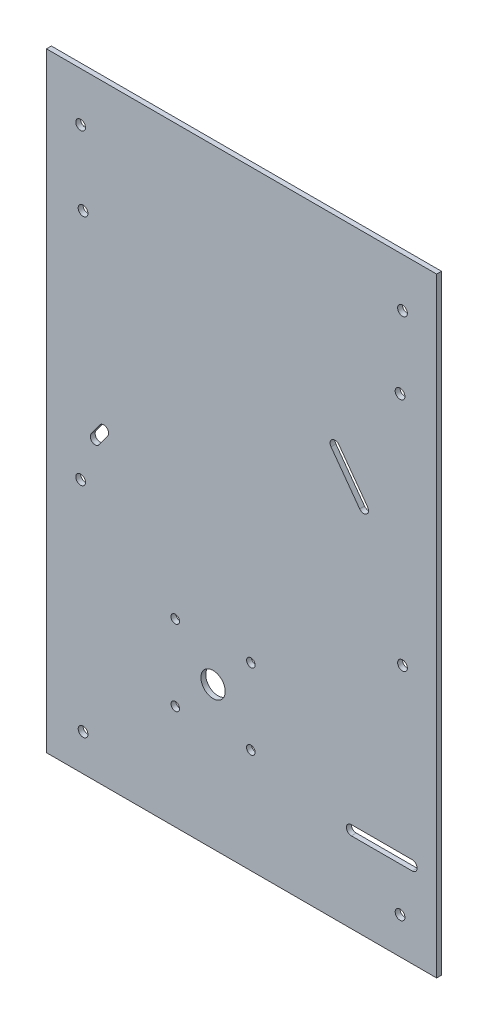
ISO-10303-21;
HEADER;
FILE_DESCRIPTION(('STEP AP214'),'2;1');
FILE_NAME('part.step','',(''),(''),'','','');
FILE_SCHEMA(('AUTOMOTIVE_DESIGN { 1 0 10303 214 1 1 1 1 }'));
ENDSEC;
DATA;
#1=APPLICATION_CONTEXT('core data for automotive mechanical design processes');
#2=APPLICATION_PROTOCOL_DEFINITION('international standard','automotive_design',2000,#1);
#3=PRODUCT_CONTEXT('',#1,'mechanical');
#4=PRODUCT('Part','Part','',(#3));
#5=PRODUCT_RELATED_PRODUCT_CATEGORY('part','',(#4));
#6=PRODUCT_DEFINITION_FORMATION('','',#4);
#7=PRODUCT_DEFINITION_CONTEXT('part definition',#1,'design');
#8=PRODUCT_DEFINITION('design','',#6,#7);
#9=PRODUCT_DEFINITION_SHAPE('','',#8);
#10=(LENGTH_UNIT() NAMED_UNIT(*) SI_UNIT(.MILLI.,.METRE.));
#11=(NAMED_UNIT(*) PLANE_ANGLE_UNIT() SI_UNIT($,.RADIAN.));
#12=(NAMED_UNIT(*) SI_UNIT($,.STERADIAN.) SOLID_ANGLE_UNIT());
#13=UNCERTAINTY_MEASURE_WITH_UNIT(LENGTH_MEASURE(1.E-05),#10,'distance_accuracy_value','');
#14=(GEOMETRIC_REPRESENTATION_CONTEXT(3) GLOBAL_UNCERTAINTY_ASSIGNED_CONTEXT((#13)) GLOBAL_UNIT_ASSIGNED_CONTEXT((#10,
#11,#12)) REPRESENTATION_CONTEXT('',''));
#15=CARTESIAN_POINT('',(0.,0.,0.));
#16=DIRECTION('',(0.,0.,1.));
#17=DIRECTION('',(1.,0.,0.));
#18=AXIS2_PLACEMENT_3D('',#15,#16,#17);
#19=CARTESIAN_POINT('',(80.,125.,-2.));
#20=DIRECTION('',(1.,0.,0.));
#21=DIRECTION('',(0.,1.,0.));
#22=AXIS2_PLACEMENT_3D('',#19,#20,#21);
#23=PLANE('',#22);
#24=DIRECTION('',(0.,1.,0.));
#25=VECTOR('',#24,1.);
#26=CARTESIAN_POINT('',(80.,125.,0.));
#27=LINE('',#26,#25);
#28=CARTESIAN_POINT('',(80.,-125.,0.));
#29=VERTEX_POINT('',#28);
#30=CARTESIAN_POINT('',(80.,125.,0.));
#31=VERTEX_POINT('',#30);
#32=EDGE_CURVE('E263',#29,#31,#27,.T.);
#33=ORIENTED_EDGE('',*,*,#32,.F.);
#34=DIRECTION('',(0.,0.,1.));
#35=VECTOR('',#34,1.);
#36=CARTESIAN_POINT('',(80.,-125.,-2.));
#37=LINE('',#36,#35);
#38=CARTESIAN_POINT('',(80.,-125.,-2.));
#39=VERTEX_POINT('',#38);
#40=EDGE_CURVE('E11',#39,#29,#37,.T.);
#41=ORIENTED_EDGE('',*,*,#40,.F.);
#42=DIRECTION('',(0.,1.,0.));
#43=VECTOR('',#42,1.);
#44=CARTESIAN_POINT('',(80.,125.,-2.));
#45=LINE('',#44,#43);
#46=CARTESIAN_POINT('',(80.,125.,-2.));
#47=VERTEX_POINT('',#46);
#48=EDGE_CURVE('E270',#39,#47,#45,.T.);
#49=ORIENTED_EDGE('',*,*,#48,.T.);
#50=DIRECTION('',(0.,0.,1.));
#51=VECTOR('',#50,1.);
#52=CARTESIAN_POINT('',(80.,125.,-2.));
#53=LINE('',#52,#51);
#54=EDGE_CURVE('E41',#47,#31,#53,.T.);
#55=ORIENTED_EDGE('',*,*,#54,.T.);
#56=EDGE_LOOP('',(#33,#41,#49,#55));
#57=FACE_BOUND('',#56,.T.);
#58=ADVANCED_FACE('F38',(#57),#23,.T.);
#59=CARTESIAN_POINT('',(-80.,-125.,-2.));
#60=DIRECTION('',(0.,-1.,0.));
#61=DIRECTION('',(0.,0.,-1.));
#62=AXIS2_PLACEMENT_3D('',#59,#60,#61);
#63=PLANE('',#62);
#64=DIRECTION('',(1.,0.,0.));
#65=VECTOR('',#64,1.);
#66=CARTESIAN_POINT('',(-80.,-125.,0.));
#67=LINE('',#66,#65);
#68=CARTESIAN_POINT('',(-80.,-125.,0.));
#69=VERTEX_POINT('',#68);
#70=EDGE_CURVE('E274',#69,#29,#67,.T.);
#71=ORIENTED_EDGE('',*,*,#70,.F.);
#72=DIRECTION('',(0.,0.,1.));
#73=VECTOR('',#72,1.);
#74=CARTESIAN_POINT('',(-80.,-125.,-2.));
#75=LINE('',#74,#73);
#76=CARTESIAN_POINT('',(-80.,-125.,-2.));
#77=VERTEX_POINT('',#76);
#78=EDGE_CURVE('E46',#77,#69,#75,.T.);
#79=ORIENTED_EDGE('',*,*,#78,.F.);
#80=DIRECTION('',(1.,0.,0.));
#81=VECTOR('',#80,1.);
#82=CARTESIAN_POINT('',(-80.,-125.,-2.));
#83=LINE('',#82,#81);
#84=EDGE_CURVE('E280',#77,#39,#83,.T.);
#85=ORIENTED_EDGE('',*,*,#84,.T.);
#86=ORIENTED_EDGE('',*,*,#40,.T.);
#87=EDGE_LOOP('',(#71,#79,#85,#86));
#88=FACE_BOUND('',#87,.T.);
#89=ADVANCED_FACE('F306',(#88),#63,.T.);
#90=CARTESIAN_POINT('',(-80.,125.,-2.));
#91=DIRECTION('',(-1.,0.,0.));
#92=DIRECTION('',(0.,-1.,0.));
#93=AXIS2_PLACEMENT_3D('',#90,#91,#92);
#94=PLANE('',#93);
#95=DIRECTION('',(0.,-1.,0.));
#96=VECTOR('',#95,1.);
#97=CARTESIAN_POINT('',(-80.,125.,0.));
#98=LINE('',#97,#96);
#99=CARTESIAN_POINT('',(-80.,125.,0.));
#100=VERTEX_POINT('',#99);
#101=EDGE_CURVE('E288',#100,#69,#98,.T.);
#102=ORIENTED_EDGE('',*,*,#101,.F.);
#103=DIRECTION('',(0.,0.,1.));
#104=VECTOR('',#103,1.);
#105=CARTESIAN_POINT('',(-80.,125.,-2.));
#106=LINE('',#105,#104);
#107=CARTESIAN_POINT('',(-80.,125.,-2.));
#108=VERTEX_POINT('',#107);
#109=EDGE_CURVE('E293',#108,#100,#106,.T.);
#110=ORIENTED_EDGE('',*,*,#109,.F.);
#111=DIRECTION('',(0.,-1.,0.));
#112=VECTOR('',#111,1.);
#113=CARTESIAN_POINT('',(-80.,125.,-2.));
#114=LINE('',#113,#112);
#115=EDGE_CURVE('E277',#108,#77,#114,.T.);
#116=ORIENTED_EDGE('',*,*,#115,.T.);
#117=ORIENTED_EDGE('',*,*,#78,.T.);
#118=EDGE_LOOP('',(#102,#110,#116,#117));
#119=FACE_BOUND('',#118,.T.);
#120=ADVANCED_FACE('F311',(#119),#94,.T.);
#121=CARTESIAN_POINT('',(-80.,125.,-2.));
#122=DIRECTION('',(0.,1.,0.));
#123=DIRECTION('',(0.,0.,1.));
#124=AXIS2_PLACEMENT_3D('',#121,#122,#123);
#125=PLANE('',#124);
#126=DIRECTION('',(-1.,0.,0.));
#127=VECTOR('',#126,1.);
#128=CARTESIAN_POINT('',(-80.,125.,0.));
#129=LINE('',#128,#127);
#130=EDGE_CURVE('E285',#31,#100,#129,.T.);
#131=ORIENTED_EDGE('',*,*,#130,.F.);
#132=ORIENTED_EDGE('',*,*,#54,.F.);
#133=DIRECTION('',(-1.,0.,0.));
#134=VECTOR('',#133,1.);
#135=CARTESIAN_POINT('',(-80.,125.,-2.));
#136=LINE('',#135,#134);
#137=EDGE_CURVE('E273',#47,#108,#136,.T.);
#138=ORIENTED_EDGE('',*,*,#137,.T.);
#139=ORIENTED_EDGE('',*,*,#109,.T.);
#140=EDGE_LOOP('',(#131,#132,#138,#139));
#141=FACE_BOUND('',#140,.T.);
#142=ADVANCED_FACE('F301',(#141),#125,.T.);
#143=CARTESIAN_POINT('',(0.,0.,-2.));
#144=DIRECTION('',(0.,0.,1.));
#145=DIRECTION('',(1.,0.,0.));
#146=AXIS2_PLACEMENT_3D('',#143,#144,#145);
#147=PLANE('',#146);
#148=CARTESIAN_POINT('',(-27.19,-51.1,-2.));
#149=DIRECTION('',(0.,0.,1.));
#150=DIRECTION('',(1.,0.,0.));
#151=AXIS2_PLACEMENT_3D('',#148,#149,#150);
#152=CIRCLE('',#151,1.75);
#153=CARTESIAN_POINT('',(-25.44,-51.1,-2.));
#154=VERTEX_POINT('',#153);
#155=EDGE_CURVE('E608',#154,#154,#152,.T.);
#156=ORIENTED_EDGE('',*,*,#155,.T.);
#157=EDGE_LOOP('',(#156));
#158=FACE_BOUND('',#157,.T.);
#159=CARTESIAN_POINT('',(3.80999999999997,-51.1,-2.));
#160=DIRECTION('',(0.,0.,1.));
#161=DIRECTION('',(1.,0.,0.));
#162=AXIS2_PLACEMENT_3D('',#159,#160,#161);
#163=CIRCLE('',#162,1.75);
#164=CARTESIAN_POINT('',(5.55999999999997,-51.1,-2.));
#165=VERTEX_POINT('',#164);
#166=EDGE_CURVE('E610',#165,#165,#163,.T.);
#167=ORIENTED_EDGE('',*,*,#166,.T.);
#168=EDGE_LOOP('',(#167));
#169=FACE_BOUND('',#168,.T.);
#170=CARTESIAN_POINT('',(3.80999999999997,-82.1,-2.));
#171=DIRECTION('',(0.,0.,1.));
#172=DIRECTION('',(1.,0.,0.));
#173=AXIS2_PLACEMENT_3D('',#170,#171,#172);
#174=CIRCLE('',#173,1.75);
#175=CARTESIAN_POINT('',(5.55999999999997,-82.1,-2.));
#176=VERTEX_POINT('',#175);
#177=EDGE_CURVE('E616',#176,#176,#174,.T.);
#178=ORIENTED_EDGE('',*,*,#177,.T.);
#179=EDGE_LOOP('',(#178));
#180=FACE_BOUND('',#179,.T.);
#181=CARTESIAN_POINT('',(-27.19,-82.1,-2.));
#182=DIRECTION('',(0.,0.,1.));
#183=DIRECTION('',(1.,0.,0.));
#184=AXIS2_PLACEMENT_3D('',#181,#182,#183);
#185=CIRCLE('',#184,1.75);
#186=CARTESIAN_POINT('',(-25.44,-82.1,-2.));
#187=VERTEX_POINT('',#186);
#188=EDGE_CURVE('E720',#187,#187,#185,.T.);
#189=ORIENTED_EDGE('',*,*,#188,.T.);
#190=EDGE_LOOP('',(#189));
#191=FACE_BOUND('',#190,.T.);
#192=CARTESIAN_POINT('',(66.,-21.,-2.));
#193=DIRECTION('',(0.,0.,1.));
#194=DIRECTION('',(1.,0.,0.));
#195=AXIS2_PLACEMENT_3D('',#192,#193,#194);
#196=CIRCLE('',#195,2.);
#197=CARTESIAN_POINT('',(68.,-21.,-2.));
#198=VERTEX_POINT('',#197);
#199=EDGE_CURVE('E201',#198,#198,#196,.T.);
#200=ORIENTED_EDGE('',*,*,#199,.T.);
#201=EDGE_LOOP('',(#200));
#202=FACE_BOUND('',#201,.T.);
#203=CARTESIAN_POINT('',(-66.,105.,-2.));
#204=DIRECTION('',(0.,0.,1.));
#205=DIRECTION('',(1.,0.,0.));
#206=AXIS2_PLACEMENT_3D('',#203,#204,#205);
#207=CIRCLE('',#206,2.);
#208=CARTESIAN_POINT('',(-64.,105.,-2.));
#209=VERTEX_POINT('',#208);
#210=EDGE_CURVE('E650',#209,#209,#207,.T.);
#211=ORIENTED_EDGE('',*,*,#210,.T.);
#212=EDGE_LOOP('',(#211));
#213=FACE_BOUND('',#212,.T.);
#214=CARTESIAN_POINT('',(66.,105.,-2.));
#215=DIRECTION('',(0.,0.,1.));
#216=DIRECTION('',(1.,0.,0.));
#217=AXIS2_PLACEMENT_3D('',#214,#215,#216);
#218=CIRCLE('',#217,2.);
#219=CARTESIAN_POINT('',(68.,105.,-2.));
#220=VERTEX_POINT('',#219);
#221=EDGE_CURVE('E635',#220,#220,#218,.T.);
#222=ORIENTED_EDGE('',*,*,#221,.T.);
#223=EDGE_LOOP('',(#222));
#224=FACE_BOUND('',#223,.T.);
#225=CARTESIAN_POINT('',(65.,75.,-2.));
#226=DIRECTION('',(0.,0.,1.));
#227=DIRECTION('',(1.,0.,0.));
#228=AXIS2_PLACEMENT_3D('',#225,#226,#227);
#229=CIRCLE('',#228,2.);
#230=CARTESIAN_POINT('',(67.,75.,-2.));
#231=VERTEX_POINT('',#230);
#232=EDGE_CURVE('E641',#231,#231,#229,.T.);
#233=ORIENTED_EDGE('',*,*,#232,.T.);
#234=EDGE_LOOP('',(#233));
#235=FACE_BOUND('',#234,.T.);
#236=CARTESIAN_POINT('',(-11.69,-66.6,-2.));
#237=DIRECTION('',(0.,0.,1.));
#238=DIRECTION('',(1.,0.,0.));
#239=AXIS2_PLACEMENT_3D('',#236,#237,#238);
#240=CIRCLE('',#239,5.);
#241=CARTESIAN_POINT('',(-6.69000000000003,-66.6,-2.));
#242=VERTEX_POINT('',#241);
#243=EDGE_CURVE('E202',#242,#242,#240,.T.);
#244=ORIENTED_EDGE('',*,*,#243,.T.);
#245=EDGE_LOOP('',(#244));
#246=FACE_BOUND('',#245,.T.);
#247=DIRECTION('',(0.586666666666667,0.809828514083211,0.));
#248=VECTOR('',#247,1.);
#249=CARTESIAN_POINT('',(-54.9003429718336,0.0156377511659183,-2.));
#250=LINE('',#249,#248);
#251=CARTESIAN_POINT('',(-58.4203429718336,-4.84333333333335,-2.));
#252=VERTEX_POINT('',#251);
#253=CARTESIAN_POINT('',(-54.9003429718336,0.0156377511659183,-2.));
#254=VERTEX_POINT('',#253);
#255=EDGE_CURVE('E218',#252,#254,#250,.T.);
#256=ORIENTED_EDGE('',*,*,#255,.T.);
#257=CARTESIAN_POINT('',(-56.52,1.18897108449926,-2.));
#258=DIRECTION('',(0.,0.,1.));
#259=DIRECTION('',(1.,0.,0.));
#260=AXIS2_PLACEMENT_3D('',#257,#258,#259);
#261=CIRCLE('',#260,2.00000000000001);
#262=CARTESIAN_POINT('',(-58.1396570281664,2.36230441783259,-2.));
#263=VERTEX_POINT('',#262);
#264=EDGE_CURVE('E210',#254,#263,#261,.T.);
#265=ORIENTED_EDGE('',*,*,#264,.T.);
#266=DIRECTION('',(-0.586666666666669,-0.80982851408321,0.));
#267=VECTOR('',#266,1.);
#268=CARTESIAN_POINT('',(-58.1396570281664,2.36230441783259,-2.));
#269=LINE('',#268,#267);
#270=CARTESIAN_POINT('',(-61.6596570281664,-2.49666666666666,-2.));
#271=VERTEX_POINT('',#270);
#272=EDGE_CURVE('E213',#263,#271,#269,.T.);
#273=ORIENTED_EDGE('',*,*,#272,.T.);
#274=CARTESIAN_POINT('',(-60.04,-3.67000000000001,-2.));
#275=DIRECTION('',(0.,0.,1.));
#276=DIRECTION('',(1.,0.,0.));
#277=AXIS2_PLACEMENT_3D('',#274,#275,#276);
#278=CIRCLE('',#277,2.00000000000001);
#279=EDGE_CURVE('E54',#271,#252,#278,.T.);
#280=ORIENTED_EDGE('',*,*,#279,.T.);
#281=EDGE_LOOP('',(#256,#265,#273,#280));
#282=FACE_BOUND('',#281,.T.);
#283=DIRECTION('',(-0.587499999999999,0.809224165481977,0.));
#284=VECTOR('',#283,1.);
#285=CARTESIAN_POINT('',(39.9284483309639,44.355,-2.));
#286=LINE('',#285,#284);
#287=CARTESIAN_POINT('',(51.6784483309639,28.1705166903604,-2.));
#288=VERTEX_POINT('',#287);
#289=CARTESIAN_POINT('',(39.9284483309639,44.355,-2.));
#290=VERTEX_POINT('',#289);
#291=EDGE_CURVE('E163',#288,#290,#286,.T.);
#292=ORIENTED_EDGE('',*,*,#291,.T.);
#293=CARTESIAN_POINT('',(38.31,43.18,-2.));
#294=DIRECTION('',(0.,0.,1.));
#295=DIRECTION('',(1.,0.,0.));
#296=AXIS2_PLACEMENT_3D('',#293,#294,#295);
#297=CIRCLE('',#296,1.99999999999999);
#298=CARTESIAN_POINT('',(36.6915516690361,42.005,-2.));
#299=VERTEX_POINT('',#298);
#300=EDGE_CURVE('E155',#290,#299,#297,.T.);
#301=ORIENTED_EDGE('',*,*,#300,.T.);
#302=DIRECTION('',(0.587499999999999,-0.809224165481977,0.));
#303=VECTOR('',#302,1.);
#304=CARTESIAN_POINT('',(36.6915516690361,42.005,-2.));
#305=LINE('',#304,#303);
#306=CARTESIAN_POINT('',(48.441551669036,25.8205166903605,-2.));
#307=VERTEX_POINT('',#306);
#308=EDGE_CURVE('E166',#299,#307,#305,.T.);
#309=ORIENTED_EDGE('',*,*,#308,.T.);
#310=CARTESIAN_POINT('',(50.06,26.9955166903604,-2.));
#311=DIRECTION('',(0.,0.,1.));
#312=DIRECTION('',(1.,0.,0.));
#313=AXIS2_PLACEMENT_3D('',#310,#311,#312);
#314=CIRCLE('',#313,1.99999999999999);
#315=EDGE_CURVE('E62',#307,#288,#314,.T.);
#316=ORIENTED_EDGE('',*,*,#315,.T.);
#317=EDGE_LOOP('',(#292,#301,#309,#316));
#318=FACE_BOUND('',#317,.T.);
#319=CARTESIAN_POINT('',(-66.,-21.,-2.));
#320=DIRECTION('',(0.,0.,1.));
#321=DIRECTION('',(1.,0.,0.));
#322=AXIS2_PLACEMENT_3D('',#319,#320,#321);
#323=CIRCLE('',#322,2.);
#324=CARTESIAN_POINT('',(-64.,-21.,-2.));
#325=VERTEX_POINT('',#324);
#326=EDGE_CURVE('E186',#325,#325,#323,.T.);
#327=ORIENTED_EDGE('',*,*,#326,.T.);
#328=EDGE_LOOP('',(#327));
#329=FACE_BOUND('',#328,.T.);
#330=CARTESIAN_POINT('',(-65.,75.,-2.));
#331=DIRECTION('',(0.,0.,1.));
#332=DIRECTION('',(1.,0.,0.));
#333=AXIS2_PLACEMENT_3D('',#330,#331,#332);
#334=CIRCLE('',#333,2.);
#335=CARTESIAN_POINT('',(-63.,75.,-2.));
#336=VERTEX_POINT('',#335);
#337=EDGE_CURVE('E620',#336,#336,#334,.T.);
#338=ORIENTED_EDGE('',*,*,#337,.T.);
#339=EDGE_LOOP('',(#338));
#340=FACE_BOUND('',#339,.T.);
#341=CARTESIAN_POINT('',(-65.,-110.,-2.));
#342=DIRECTION('',(0.,0.,1.));
#343=DIRECTION('',(1.,0.,0.));
#344=AXIS2_PLACEMENT_3D('',#341,#342,#343);
#345=CIRCLE('',#344,2.);
#346=CARTESIAN_POINT('',(-63.,-110.,-2.));
#347=VERTEX_POINT('',#346);
#348=EDGE_CURVE('E627',#347,#347,#345,.T.);
#349=ORIENTED_EDGE('',*,*,#348,.T.);
#350=EDGE_LOOP('',(#349));
#351=FACE_BOUND('',#350,.T.);
#352=CARTESIAN_POINT('',(65.,-110.,-2.));
#353=DIRECTION('',(0.,0.,1.));
#354=DIRECTION('',(1.,0.,0.));
#355=AXIS2_PLACEMENT_3D('',#352,#353,#354);
#356=CIRCLE('',#355,2.);
#357=CARTESIAN_POINT('',(67.,-110.,-2.));
#358=VERTEX_POINT('',#357);
#359=EDGE_CURVE('E613',#358,#358,#356,.T.);
#360=ORIENTED_EDGE('',*,*,#359,.T.);
#361=EDGE_LOOP('',(#360));
#362=FACE_BOUND('',#361,.T.);
#363=DIRECTION('',(1.,0.,0.));
#364=VECTOR('',#363,1.);
#365=CARTESIAN_POINT('',(70.,-92.,-2.));
#366=LINE('',#365,#364);
#367=CARTESIAN_POINT('',(45.,-92.,-2.));
#368=VERTEX_POINT('',#367);
#369=CARTESIAN_POINT('',(70.,-92.,-2.));
#370=VERTEX_POINT('',#369);
#371=EDGE_CURVE('E248',#368,#370,#366,.T.);
#372=ORIENTED_EDGE('',*,*,#371,.T.);
#373=CARTESIAN_POINT('',(70.,-90.,-2.));
#374=DIRECTION('',(0.,0.,1.));
#375=DIRECTION('',(1.,0.,0.));
#376=AXIS2_PLACEMENT_3D('',#373,#374,#375);
#377=CIRCLE('',#376,1.99999999999999);
#378=CARTESIAN_POINT('',(70.,-88.,-2.));
#379=VERTEX_POINT('',#378);
#380=EDGE_CURVE('E238',#370,#379,#377,.T.);
#381=ORIENTED_EDGE('',*,*,#380,.T.);
#382=DIRECTION('',(-1.,0.,0.));
#383=VECTOR('',#382,1.);
#384=CARTESIAN_POINT('',(70.,-88.,-2.));
#385=LINE('',#384,#383);
#386=CARTESIAN_POINT('',(45.,-88.,-2.));
#387=VERTEX_POINT('',#386);
#388=EDGE_CURVE('E241',#379,#387,#385,.T.);
#389=ORIENTED_EDGE('',*,*,#388,.T.);
#390=CARTESIAN_POINT('',(45.,-90.,-2.));
#391=DIRECTION('',(0.,0.,1.));
#392=DIRECTION('',(1.,0.,0.));
#393=AXIS2_PLACEMENT_3D('',#390,#391,#392);
#394=CIRCLE('',#393,2.00000000000001);
#395=EDGE_CURVE('E245',#387,#368,#394,.T.);
#396=ORIENTED_EDGE('',*,*,#395,.T.);
#397=EDGE_LOOP('',(#372,#381,#389,#396));
#398=FACE_BOUND('',#397,.T.);
#399=ORIENTED_EDGE('',*,*,#48,.F.);
#400=ORIENTED_EDGE('',*,*,#84,.F.);
#401=ORIENTED_EDGE('',*,*,#115,.F.);
#402=ORIENTED_EDGE('',*,*,#137,.F.);
#403=EDGE_LOOP('',(#399,#400,#401,#402));
#404=FACE_BOUND('',#403,.T.);
#405=ADVANCED_FACE('F170',(#158,#169,#180,#191,#202,#213,#224,#235,#246,#282,#318,#329,#340,
#351,#362,#398,#404),#147,.F.);
#406=CARTESIAN_POINT('',(0.,0.,0.));
#407=DIRECTION('',(0.,0.,1.));
#408=DIRECTION('',(1.,0.,0.));
#409=AXIS2_PLACEMENT_3D('',#406,#407,#408);
#410=PLANE('',#409);
#411=CARTESIAN_POINT('',(-27.19,-51.1,0.));
#412=DIRECTION('',(0.,0.,1.));
#413=DIRECTION('',(1.,0.,0.));
#414=AXIS2_PLACEMENT_3D('',#411,#412,#413);
#415=CIRCLE('',#414,1.75);
#416=CARTESIAN_POINT('',(-25.44,-51.1,0.));
#417=VERTEX_POINT('',#416);
#418=EDGE_CURVE('E605',#417,#417,#415,.T.);
#419=ORIENTED_EDGE('',*,*,#418,.F.);
#420=EDGE_LOOP('',(#419));
#421=FACE_BOUND('',#420,.T.);
#422=CARTESIAN_POINT('',(3.80999999999997,-51.1,0.));
#423=DIRECTION('',(0.,0.,1.));
#424=DIRECTION('',(1.,0.,0.));
#425=AXIS2_PLACEMENT_3D('',#422,#423,#424);
#426=CIRCLE('',#425,1.75);
#427=CARTESIAN_POINT('',(5.55999999999997,-51.1,0.));
#428=VERTEX_POINT('',#427);
#429=EDGE_CURVE('E728',#428,#428,#426,.T.);
#430=ORIENTED_EDGE('',*,*,#429,.F.);
#431=EDGE_LOOP('',(#430));
#432=FACE_BOUND('',#431,.T.);
#433=CARTESIAN_POINT('',(3.80999999999997,-82.1,0.));
#434=DIRECTION('',(0.,0.,1.));
#435=DIRECTION('',(1.,0.,0.));
#436=AXIS2_PLACEMENT_3D('',#433,#434,#435);
#437=CIRCLE('',#436,1.75);
#438=CARTESIAN_POINT('',(5.55999999999997,-82.1,0.));
#439=VERTEX_POINT('',#438);
#440=EDGE_CURVE('E726',#439,#439,#437,.T.);
#441=ORIENTED_EDGE('',*,*,#440,.F.);
#442=EDGE_LOOP('',(#441));
#443=FACE_BOUND('',#442,.T.);
#444=CARTESIAN_POINT('',(-27.19,-82.1,0.));
#445=DIRECTION('',(0.,0.,1.));
#446=DIRECTION('',(1.,0.,0.));
#447=AXIS2_PLACEMENT_3D('',#444,#445,#446);
#448=CIRCLE('',#447,1.75);
#449=CARTESIAN_POINT('',(-25.44,-82.1,0.));
#450=VERTEX_POINT('',#449);
#451=EDGE_CURVE('E723',#450,#450,#448,.T.);
#452=ORIENTED_EDGE('',*,*,#451,.F.);
#453=EDGE_LOOP('',(#452));
#454=FACE_BOUND('',#453,.T.);
#455=CARTESIAN_POINT('',(66.,-21.,0.));
#456=DIRECTION('',(0.,0.,1.));
#457=DIRECTION('',(1.,0.,0.));
#458=AXIS2_PLACEMENT_3D('',#455,#456,#457);
#459=CIRCLE('',#458,2.);
#460=CARTESIAN_POINT('',(68.,-21.,0.));
#461=VERTEX_POINT('',#460);
#462=EDGE_CURVE('E648',#461,#461,#459,.T.);
#463=ORIENTED_EDGE('',*,*,#462,.F.);
#464=EDGE_LOOP('',(#463));
#465=FACE_BOUND('',#464,.T.);
#466=CARTESIAN_POINT('',(-66.,105.,0.));
#467=DIRECTION('',(0.,0.,1.));
#468=DIRECTION('',(1.,0.,0.));
#469=AXIS2_PLACEMENT_3D('',#466,#467,#468);
#470=CIRCLE('',#469,2.);
#471=CARTESIAN_POINT('',(-64.,105.,0.));
#472=VERTEX_POINT('',#471);
#473=EDGE_CURVE('E179',#472,#472,#470,.T.);
#474=ORIENTED_EDGE('',*,*,#473,.F.);
#475=EDGE_LOOP('',(#474));
#476=FACE_BOUND('',#475,.T.);
#477=CARTESIAN_POINT('',(66.,105.,0.));
#478=DIRECTION('',(0.,0.,1.));
#479=DIRECTION('',(1.,0.,0.));
#480=AXIS2_PLACEMENT_3D('',#477,#478,#479);
#481=CIRCLE('',#480,2.);
#482=CARTESIAN_POINT('',(68.,105.,0.));
#483=VERTEX_POINT('',#482);
#484=EDGE_CURVE('E638',#483,#483,#481,.T.);
#485=ORIENTED_EDGE('',*,*,#484,.F.);
#486=EDGE_LOOP('',(#485));
#487=FACE_BOUND('',#486,.T.);
#488=CARTESIAN_POINT('',(65.,75.,0.));
#489=DIRECTION('',(0.,0.,1.));
#490=DIRECTION('',(1.,0.,0.));
#491=AXIS2_PLACEMENT_3D('',#488,#489,#490);
#492=CIRCLE('',#491,2.);
#493=CARTESIAN_POINT('',(67.,75.,0.));
#494=VERTEX_POINT('',#493);
#495=EDGE_CURVE('E623',#494,#494,#492,.T.);
#496=ORIENTED_EDGE('',*,*,#495,.F.);
#497=EDGE_LOOP('',(#496));
#498=FACE_BOUND('',#497,.T.);
#499=CARTESIAN_POINT('',(-11.69,-66.6,0.));
#500=DIRECTION('',(0.,0.,1.));
#501=DIRECTION('',(1.,0.,0.));
#502=AXIS2_PLACEMENT_3D('',#499,#500,#501);
#503=CIRCLE('',#502,5.);
#504=CARTESIAN_POINT('',(-6.69000000000003,-66.6,0.));
#505=VERTEX_POINT('',#504);
#506=EDGE_CURVE('E206',#505,#505,#503,.T.);
#507=ORIENTED_EDGE('',*,*,#506,.F.);
#508=EDGE_LOOP('',(#507));
#509=FACE_BOUND('',#508,.T.);
#510=CARTESIAN_POINT('',(-56.52,1.18897108449926,0.));
#511=DIRECTION('',(0.,0.,1.));
#512=DIRECTION('',(1.,0.,0.));
#513=AXIS2_PLACEMENT_3D('',#510,#511,#512);
#514=CIRCLE('',#513,2.00000000000001);
#515=CARTESIAN_POINT('',(-54.9003429718336,0.0156377511659183,0.));
#516=VERTEX_POINT('',#515);
#517=CARTESIAN_POINT('',(-58.1396570281664,2.36230441783259,0.));
#518=VERTEX_POINT('',#517);
#519=EDGE_CURVE('E192',#516,#518,#514,.T.);
#520=ORIENTED_EDGE('',*,*,#519,.F.);
#521=DIRECTION('',(0.586666666666667,0.809828514083211,0.));
#522=VECTOR('',#521,1.);
#523=CARTESIAN_POINT('',(-54.9003429718336,0.0156377511659183,0.));
#524=LINE('',#523,#522);
#525=CARTESIAN_POINT('',(-58.4203429718336,-4.84333333333335,0.));
#526=VERTEX_POINT('',#525);
#527=EDGE_CURVE('E214',#526,#516,#524,.T.);
#528=ORIENTED_EDGE('',*,*,#527,.F.);
#529=CARTESIAN_POINT('',(-60.04,-3.67000000000001,0.));
#530=DIRECTION('',(0.,0.,1.));
#531=DIRECTION('',(1.,0.,0.));
#532=AXIS2_PLACEMENT_3D('',#529,#530,#531);
#533=CIRCLE('',#532,2.00000000000001);
#534=CARTESIAN_POINT('',(-61.6596570281664,-2.49666666666666,0.));
#535=VERTEX_POINT('',#534);
#536=EDGE_CURVE('E226',#535,#526,#533,.T.);
#537=ORIENTED_EDGE('',*,*,#536,.F.);
#538=DIRECTION('',(-0.586666666666669,-0.80982851408321,0.));
#539=VECTOR('',#538,1.);
#540=CARTESIAN_POINT('',(-58.1396570281664,2.36230441783259,0.));
#541=LINE('',#540,#539);
#542=EDGE_CURVE('E223',#518,#535,#541,.T.);
#543=ORIENTED_EDGE('',*,*,#542,.F.);
#544=EDGE_LOOP('',(#520,#528,#537,#543));
#545=FACE_BOUND('',#544,.T.);
#546=CARTESIAN_POINT('',(38.31,43.18,0.));
#547=DIRECTION('',(0.,0.,1.));
#548=DIRECTION('',(1.,0.,0.));
#549=AXIS2_PLACEMENT_3D('',#546,#547,#548);
#550=CIRCLE('',#549,1.99999999999999);
#551=CARTESIAN_POINT('',(39.9284483309639,44.355,0.));
#552=VERTEX_POINT('',#551);
#553=CARTESIAN_POINT('',(36.691551669036,42.005,0.));
#554=VERTEX_POINT('',#553);
#555=EDGE_CURVE('E158',#552,#554,#550,.T.);
#556=ORIENTED_EDGE('',*,*,#555,.F.);
#557=DIRECTION('',(-0.587499999999999,0.809224165481977,0.));
#558=VECTOR('',#557,1.);
#559=CARTESIAN_POINT('',(39.9284483309639,44.355,0.));
#560=LINE('',#559,#558);
#561=CARTESIAN_POINT('',(51.6784483309639,28.1705166903604,0.));
#562=VERTEX_POINT('',#561);
#563=EDGE_CURVE('E173',#562,#552,#560,.T.);
#564=ORIENTED_EDGE('',*,*,#563,.F.);
#565=CARTESIAN_POINT('',(50.06,26.9955166903604,0.));
#566=DIRECTION('',(0.,0.,1.));
#567=DIRECTION('',(1.,0.,0.));
#568=AXIS2_PLACEMENT_3D('',#565,#566,#567);
#569=CIRCLE('',#568,1.99999999999999);
#570=CARTESIAN_POINT('',(48.441551669036,25.8205166903605,0.));
#571=VERTEX_POINT('',#570);
#572=EDGE_CURVE('E176',#571,#562,#569,.T.);
#573=ORIENTED_EDGE('',*,*,#572,.F.);
#574=DIRECTION('',(0.587499999999999,-0.809224165481977,0.));
#575=VECTOR('',#574,1.);
#576=CARTESIAN_POINT('',(36.6915516690361,42.005,0.));
#577=LINE('',#576,#575);
#578=EDGE_CURVE('E185',#554,#571,#577,.T.);
#579=ORIENTED_EDGE('',*,*,#578,.F.);
#580=EDGE_LOOP('',(#556,#564,#573,#579));
#581=FACE_BOUND('',#580,.T.);
#582=CARTESIAN_POINT('',(-66.,-21.,0.));
#583=DIRECTION('',(0.,0.,1.));
#584=DIRECTION('',(1.,0.,0.));
#585=AXIS2_PLACEMENT_3D('',#582,#583,#584);
#586=CIRCLE('',#585,2.);
#587=CARTESIAN_POINT('',(-64.,-21.,0.));
#588=VERTEX_POINT('',#587);
#589=EDGE_CURVE('E198',#588,#588,#586,.T.);
#590=ORIENTED_EDGE('',*,*,#589,.F.);
#591=EDGE_LOOP('',(#590));
#592=FACE_BOUND('',#591,.T.);
#593=CARTESIAN_POINT('',(-65.,75.,0.));
#594=DIRECTION('',(0.,0.,1.));
#595=DIRECTION('',(1.,0.,0.));
#596=AXIS2_PLACEMENT_3D('',#593,#594,#595);
#597=CIRCLE('',#596,2.);
#598=CARTESIAN_POINT('',(-63.,75.,0.));
#599=VERTEX_POINT('',#598);
#600=EDGE_CURVE('E624',#599,#599,#597,.T.);
#601=ORIENTED_EDGE('',*,*,#600,.F.);
#602=EDGE_LOOP('',(#601));
#603=FACE_BOUND('',#602,.T.);
#604=CARTESIAN_POINT('',(-65.,-110.,0.));
#605=DIRECTION('',(0.,0.,1.));
#606=DIRECTION('',(1.,0.,0.));
#607=AXIS2_PLACEMENT_3D('',#604,#605,#606);
#608=CIRCLE('',#607,2.);
#609=CARTESIAN_POINT('',(-63.,-110.,0.));
#610=VERTEX_POINT('',#609);
#611=EDGE_CURVE('E630',#610,#610,#608,.T.);
#612=ORIENTED_EDGE('',*,*,#611,.F.);
#613=EDGE_LOOP('',(#612));
#614=FACE_BOUND('',#613,.T.);
#615=CARTESIAN_POINT('',(65.,-110.,0.));
#616=DIRECTION('',(0.,0.,1.));
#617=DIRECTION('',(1.,0.,0.));
#618=AXIS2_PLACEMENT_3D('',#615,#616,#617);
#619=CIRCLE('',#618,2.);
#620=CARTESIAN_POINT('',(67.,-110.,0.));
#621=VERTEX_POINT('',#620);
#622=EDGE_CURVE('E609',#621,#621,#619,.T.);
#623=ORIENTED_EDGE('',*,*,#622,.F.);
#624=EDGE_LOOP('',(#623));
#625=FACE_BOUND('',#624,.T.);
#626=CARTESIAN_POINT('',(70.,-90.,0.));
#627=DIRECTION('',(0.,0.,1.));
#628=DIRECTION('',(1.,0.,0.));
#629=AXIS2_PLACEMENT_3D('',#626,#627,#628);
#630=CIRCLE('',#629,1.99999999999999);
#631=CARTESIAN_POINT('',(70.,-92.,0.));
#632=VERTEX_POINT('',#631);
#633=CARTESIAN_POINT('',(70.,-88.,0.));
#634=VERTEX_POINT('',#633);
#635=EDGE_CURVE('E205',#632,#634,#630,.T.);
#636=ORIENTED_EDGE('',*,*,#635,.F.);
#637=DIRECTION('',(1.,0.,0.));
#638=VECTOR('',#637,1.);
#639=CARTESIAN_POINT('',(70.,-92.,0.));
#640=LINE('',#639,#638);
#641=CARTESIAN_POINT('',(45.,-92.,0.));
#642=VERTEX_POINT('',#641);
#643=EDGE_CURVE('E242',#642,#632,#640,.T.);
#644=ORIENTED_EDGE('',*,*,#643,.F.);
#645=CARTESIAN_POINT('',(45.,-90.,0.));
#646=DIRECTION('',(0.,0.,1.));
#647=DIRECTION('',(1.,0.,0.));
#648=AXIS2_PLACEMENT_3D('',#645,#646,#647);
#649=CIRCLE('',#648,2.00000000000001);
#650=CARTESIAN_POINT('',(45.,-88.,0.));
#651=VERTEX_POINT('',#650);
#652=EDGE_CURVE('E256',#651,#642,#649,.T.);
#653=ORIENTED_EDGE('',*,*,#652,.F.);
#654=DIRECTION('',(-1.,0.,0.));
#655=VECTOR('',#654,1.);
#656=CARTESIAN_POINT('',(70.,-88.,0.));
#657=LINE('',#656,#655);
#658=EDGE_CURVE('E253',#634,#651,#657,.T.);
#659=ORIENTED_EDGE('',*,*,#658,.F.);
#660=EDGE_LOOP('',(#636,#644,#653,#659));
#661=FACE_BOUND('',#660,.T.);
#662=ORIENTED_EDGE('',*,*,#32,.T.);
#663=ORIENTED_EDGE('',*,*,#130,.T.);
#664=ORIENTED_EDGE('',*,*,#101,.T.);
#665=ORIENTED_EDGE('',*,*,#70,.T.);
#666=EDGE_LOOP('',(#662,#663,#664,#665));
#667=FACE_BOUND('',#666,.T.);
#668=ADVANCED_FACE('F303',(#421,#432,#443,#454,#465,#476,#487,#498,#509,#545,#581,#592,#603,
#614,#625,#661,#667),#410,.T.);
#669=CARTESIAN_POINT('',(70.,-90.,-2.));
#670=DIRECTION('',(0.,0.,1.));
#671=DIRECTION('',(1.,0.,0.));
#672=AXIS2_PLACEMENT_3D('',#669,#670,#671);
#673=CYLINDRICAL_SURFACE('',#672,1.99999999999999);
#674=ORIENTED_EDGE('',*,*,#635,.T.);
#675=DIRECTION('',(0.,0.,1.));
#676=VECTOR('',#675,1.);
#677=CARTESIAN_POINT('',(70.,-88.,-2.));
#678=LINE('',#677,#676);
#679=EDGE_CURVE('E251',#379,#634,#678,.T.);
#680=ORIENTED_EDGE('',*,*,#679,.F.);
#681=ORIENTED_EDGE('',*,*,#380,.F.);
#682=DIRECTION('',(0.,0.,1.));
#683=VECTOR('',#682,1.);
#684=CARTESIAN_POINT('',(70.,-92.,-2.));
#685=LINE('',#684,#683);
#686=EDGE_CURVE('E261',#370,#632,#685,.T.);
#687=ORIENTED_EDGE('',*,*,#686,.T.);
#688=EDGE_LOOP('',(#674,#680,#681,#687));
#689=FACE_BOUND('',#688,.T.);
#690=ADVANCED_FACE('F343',(#689),#673,.F.);
#691=CARTESIAN_POINT('',(70.,-92.,-2.));
#692=DIRECTION('',(0.,-1.,0.));
#693=DIRECTION('',(1.,0.,0.));
#694=AXIS2_PLACEMENT_3D('',#691,#692,#693);
#695=PLANE('',#694);
#696=ORIENTED_EDGE('',*,*,#643,.T.);
#697=ORIENTED_EDGE('',*,*,#686,.F.);
#698=ORIENTED_EDGE('',*,*,#371,.F.);
#699=DIRECTION('',(0.,0.,1.));
#700=VECTOR('',#699,1.);
#701=CARTESIAN_POINT('',(45.,-92.,-2.));
#702=LINE('',#701,#700);
#703=EDGE_CURVE('E264',#368,#642,#702,.T.);
#704=ORIENTED_EDGE('',*,*,#703,.T.);
#705=EDGE_LOOP('',(#696,#697,#698,#704));
#706=FACE_BOUND('',#705,.T.);
#707=ADVANCED_FACE('F348',(#706),#695,.F.);
#708=CARTESIAN_POINT('',(45.,-90.,-2.));
#709=DIRECTION('',(0.,0.,1.));
#710=DIRECTION('',(1.,0.,0.));
#711=AXIS2_PLACEMENT_3D('',#708,#709,#710);
#712=CYLINDRICAL_SURFACE('',#711,2.00000000000001);
#713=ORIENTED_EDGE('',*,*,#652,.T.);
#714=ORIENTED_EDGE('',*,*,#703,.F.);
#715=ORIENTED_EDGE('',*,*,#395,.F.);
#716=DIRECTION('',(0.,0.,1.));
#717=VECTOR('',#716,1.);
#718=CARTESIAN_POINT('',(45.,-88.,-2.));
#719=LINE('',#718,#717);
#720=EDGE_CURVE('E266',#387,#651,#719,.T.);
#721=ORIENTED_EDGE('',*,*,#720,.T.);
#722=EDGE_LOOP('',(#713,#714,#715,#721));
#723=FACE_BOUND('',#722,.T.);
#724=ADVANCED_FACE('F360',(#723),#712,.F.);
#725=CARTESIAN_POINT('',(70.,-88.,-2.));
#726=DIRECTION('',(0.,1.,0.));
#727=DIRECTION('',(-1.,0.,0.));
#728=AXIS2_PLACEMENT_3D('',#725,#726,#727);
#729=PLANE('',#728);
#730=ORIENTED_EDGE('',*,*,#658,.T.);
#731=ORIENTED_EDGE('',*,*,#720,.F.);
#732=ORIENTED_EDGE('',*,*,#388,.F.);
#733=ORIENTED_EDGE('',*,*,#679,.T.);
#734=EDGE_LOOP('',(#730,#731,#732,#733));
#735=FACE_BOUND('',#734,.T.);
#736=ADVANCED_FACE('F370',(#735),#729,.F.);
#737=CARTESIAN_POINT('',(65.,-110.,-2.));
#738=DIRECTION('',(0.,0.,1.));
#739=DIRECTION('',(1.,0.,0.));
#740=AXIS2_PLACEMENT_3D('',#737,#738,#739);
#741=CYLINDRICAL_SURFACE('',#740,2.);
#742=ORIENTED_EDGE('',*,*,#359,.F.);
#743=EDGE_LOOP('',(#742));
#744=FACE_BOUND('',#743,.T.);
#745=ORIENTED_EDGE('',*,*,#622,.T.);
#746=EDGE_LOOP('',(#745));
#747=FACE_BOUND('',#746,.T.);
#748=ADVANCED_FACE('F380',(#744,#747),#741,.F.);
#749=CARTESIAN_POINT('',(-65.,-110.,-2.));
#750=DIRECTION('',(0.,0.,1.));
#751=DIRECTION('',(1.,0.,0.));
#752=AXIS2_PLACEMENT_3D('',#749,#750,#751);
#753=CYLINDRICAL_SURFACE('',#752,2.);
#754=ORIENTED_EDGE('',*,*,#348,.F.);
#755=EDGE_LOOP('',(#754));
#756=FACE_BOUND('',#755,.T.);
#757=ORIENTED_EDGE('',*,*,#611,.T.);
#758=EDGE_LOOP('',(#757));
#759=FACE_BOUND('',#758,.T.);
#760=ADVANCED_FACE('F390',(#756,#759),#753,.F.);
#761=CARTESIAN_POINT('',(-65.,75.,-2.));
#762=DIRECTION('',(0.,0.,1.));
#763=DIRECTION('',(1.,0.,0.));
#764=AXIS2_PLACEMENT_3D('',#761,#762,#763);
#765=CYLINDRICAL_SURFACE('',#764,2.);
#766=ORIENTED_EDGE('',*,*,#337,.F.);
#767=EDGE_LOOP('',(#766));
#768=FACE_BOUND('',#767,.T.);
#769=ORIENTED_EDGE('',*,*,#600,.T.);
#770=EDGE_LOOP('',(#769));
#771=FACE_BOUND('',#770,.T.);
#772=ADVANCED_FACE('F400',(#768,#771),#765,.F.);
#773=CARTESIAN_POINT('',(-66.,-21.,-2.));
#774=DIRECTION('',(0.,0.,1.));
#775=DIRECTION('',(1.,0.,0.));
#776=AXIS2_PLACEMENT_3D('',#773,#774,#775);
#777=CYLINDRICAL_SURFACE('',#776,2.);
#778=ORIENTED_EDGE('',*,*,#326,.F.);
#779=EDGE_LOOP('',(#778));
#780=FACE_BOUND('',#779,.T.);
#781=ORIENTED_EDGE('',*,*,#589,.T.);
#782=EDGE_LOOP('',(#781));
#783=FACE_BOUND('',#782,.T.);
#784=ADVANCED_FACE('F410',(#780,#783),#777,.F.);
#785=CARTESIAN_POINT('',(38.31,43.18,-2.));
#786=DIRECTION('',(0.,0.,1.));
#787=DIRECTION('',(1.,0.,0.));
#788=AXIS2_PLACEMENT_3D('',#785,#786,#787);
#789=CYLINDRICAL_SURFACE('',#788,1.99999999999999);
#790=ORIENTED_EDGE('',*,*,#555,.T.);
#791=DIRECTION('',(0.,0.,1.));
#792=VECTOR('',#791,1.);
#793=CARTESIAN_POINT('',(36.6915516690361,42.005,-2.));
#794=LINE('',#793,#792);
#795=EDGE_CURVE('E151',#299,#554,#794,.T.);
#796=ORIENTED_EDGE('',*,*,#795,.F.);
#797=ORIENTED_EDGE('',*,*,#300,.F.);
#798=DIRECTION('',(0.,0.,1.));
#799=VECTOR('',#798,1.);
#800=CARTESIAN_POINT('',(39.9284483309639,44.355,-2.));
#801=LINE('',#800,#799);
#802=EDGE_CURVE('E190',#290,#552,#801,.T.);
#803=ORIENTED_EDGE('',*,*,#802,.T.);
#804=EDGE_LOOP('',(#790,#796,#797,#803));
#805=FACE_BOUND('',#804,.T.);
#806=ADVANCED_FACE('F153',(#805),#789,.F.);
#807=CARTESIAN_POINT('',(39.9284483309639,44.355,-2.));
#808=DIRECTION('',(0.809224165481977,0.587499999999999,0.));
#809=DIRECTION('',(-0.587499999999999,0.809224165481977,0.));
#810=AXIS2_PLACEMENT_3D('',#807,#808,#809);
#811=PLANE('',#810);
#812=ORIENTED_EDGE('',*,*,#563,.T.);
#813=ORIENTED_EDGE('',*,*,#802,.F.);
#814=ORIENTED_EDGE('',*,*,#291,.F.);
#815=DIRECTION('',(0.,0.,1.));
#816=VECTOR('',#815,1.);
#817=CARTESIAN_POINT('',(51.6784483309639,28.1705166903604,-2.));
#818=LINE('',#817,#816);
#819=EDGE_CURVE('E193',#288,#562,#818,.T.);
#820=ORIENTED_EDGE('',*,*,#819,.T.);
#821=EDGE_LOOP('',(#812,#813,#814,#820));
#822=FACE_BOUND('',#821,.T.);
#823=ADVANCED_FACE('F429',(#822),#811,.F.);
#824=CARTESIAN_POINT('',(50.06,26.9955166903604,-2.));
#825=DIRECTION('',(0.,0.,1.));
#826=DIRECTION('',(1.,0.,0.));
#827=AXIS2_PLACEMENT_3D('',#824,#825,#826);
#828=CYLINDRICAL_SURFACE('',#827,1.99999999999999);
#829=ORIENTED_EDGE('',*,*,#572,.T.);
#830=ORIENTED_EDGE('',*,*,#819,.F.);
#831=ORIENTED_EDGE('',*,*,#315,.F.);
#832=DIRECTION('',(0.,0.,1.));
#833=VECTOR('',#832,1.);
#834=CARTESIAN_POINT('',(48.441551669036,25.8205166903605,-2.));
#835=LINE('',#834,#833);
#836=EDGE_CURVE('E162',#307,#571,#835,.T.);
#837=ORIENTED_EDGE('',*,*,#836,.T.);
#838=EDGE_LOOP('',(#829,#830,#831,#837));
#839=FACE_BOUND('',#838,.T.);
#840=ADVANCED_FACE('F438',(#839),#828,.F.);
#841=CARTESIAN_POINT('',(36.6915516690361,42.005,-2.));
#842=DIRECTION('',(-0.809224165481977,-0.587499999999999,0.));
#843=DIRECTION('',(0.587499999999999,-0.809224165481977,0.));
#844=AXIS2_PLACEMENT_3D('',#841,#842,#843);
#845=PLANE('',#844);
#846=ORIENTED_EDGE('',*,*,#578,.T.);
#847=ORIENTED_EDGE('',*,*,#836,.F.);
#848=ORIENTED_EDGE('',*,*,#308,.F.);
#849=ORIENTED_EDGE('',*,*,#795,.T.);
#850=EDGE_LOOP('',(#846,#847,#848,#849));
#851=FACE_BOUND('',#850,.T.);
#852=ADVANCED_FACE('F167',(#851),#845,.F.);
#853=CARTESIAN_POINT('',(-56.52,1.18897108449926,-2.));
#854=DIRECTION('',(0.,0.,1.));
#855=DIRECTION('',(1.,0.,0.));
#856=AXIS2_PLACEMENT_3D('',#853,#854,#855);
#857=CYLINDRICAL_SURFACE('',#856,2.00000000000001);
#858=ORIENTED_EDGE('',*,*,#519,.T.);
#859=DIRECTION('',(0.,0.,1.));
#860=VECTOR('',#859,1.);
#861=CARTESIAN_POINT('',(-58.1396570281664,2.36230441783259,-2.));
#862=LINE('',#861,#860);
#863=EDGE_CURVE('E221',#263,#518,#862,.T.);
#864=ORIENTED_EDGE('',*,*,#863,.F.);
#865=ORIENTED_EDGE('',*,*,#264,.F.);
#866=DIRECTION('',(0.,0.,1.));
#867=VECTOR('',#866,1.);
#868=CARTESIAN_POINT('',(-54.9003429718336,0.0156377511659183,-2.));
#869=LINE('',#868,#867);
#870=EDGE_CURVE('E209',#254,#516,#869,.T.);
#871=ORIENTED_EDGE('',*,*,#870,.T.);
#872=EDGE_LOOP('',(#858,#864,#865,#871));
#873=FACE_BOUND('',#872,.T.);
#874=ADVANCED_FACE('F456',(#873),#857,.F.);
#875=CARTESIAN_POINT('',(-54.9003429718336,0.0156377511659183,-2.));
#876=DIRECTION('',(0.809828514083211,-0.586666666666667,0.));
#877=DIRECTION('',(0.586666666666667,0.809828514083211,0.));
#878=AXIS2_PLACEMENT_3D('',#875,#876,#877);
#879=PLANE('',#878);
#880=ORIENTED_EDGE('',*,*,#527,.T.);
#881=ORIENTED_EDGE('',*,*,#870,.F.);
#882=ORIENTED_EDGE('',*,*,#255,.F.);
#883=DIRECTION('',(0.,0.,1.));
#884=VECTOR('',#883,1.);
#885=CARTESIAN_POINT('',(-58.4203429718336,-4.84333333333335,-2.));
#886=LINE('',#885,#884);
#887=EDGE_CURVE('E232',#252,#526,#886,.T.);
#888=ORIENTED_EDGE('',*,*,#887,.T.);
#889=EDGE_LOOP('',(#880,#881,#882,#888));
#890=FACE_BOUND('',#889,.T.);
#891=ADVANCED_FACE('F465',(#890),#879,.F.);
#892=CARTESIAN_POINT('',(-60.04,-3.67000000000001,-2.));
#893=DIRECTION('',(0.,0.,1.));
#894=DIRECTION('',(1.,0.,0.));
#895=AXIS2_PLACEMENT_3D('',#892,#893,#894);
#896=CYLINDRICAL_SURFACE('',#895,2.00000000000001);
#897=ORIENTED_EDGE('',*,*,#536,.T.);
#898=ORIENTED_EDGE('',*,*,#887,.F.);
#899=ORIENTED_EDGE('',*,*,#279,.F.);
#900=DIRECTION('',(0.,0.,1.));
#901=VECTOR('',#900,1.);
#902=CARTESIAN_POINT('',(-61.6596570281664,-2.49666666666666,-2.));
#903=LINE('',#902,#901);
#904=EDGE_CURVE('E234',#271,#535,#903,.T.);
#905=ORIENTED_EDGE('',*,*,#904,.T.);
#906=EDGE_LOOP('',(#897,#898,#899,#905));
#907=FACE_BOUND('',#906,.T.);
#908=ADVANCED_FACE('F475',(#907),#896,.F.);
#909=CARTESIAN_POINT('',(-58.1396570281664,2.36230441783259,-2.));
#910=DIRECTION('',(-0.80982851408321,0.586666666666669,0.));
#911=DIRECTION('',(-0.586666666666669,-0.80982851408321,0.));
#912=AXIS2_PLACEMENT_3D('',#909,#910,#911);
#913=PLANE('',#912);
#914=ORIENTED_EDGE('',*,*,#542,.T.);
#915=ORIENTED_EDGE('',*,*,#904,.F.);
#916=ORIENTED_EDGE('',*,*,#272,.F.);
#917=ORIENTED_EDGE('',*,*,#863,.T.);
#918=EDGE_LOOP('',(#914,#915,#916,#917));
#919=FACE_BOUND('',#918,.T.);
#920=ADVANCED_FACE('F485',(#919),#913,.F.);
#921=CARTESIAN_POINT('',(-11.69,-66.6,-2.));
#922=DIRECTION('',(0.,0.,1.));
#923=DIRECTION('',(1.,0.,0.));
#924=AXIS2_PLACEMENT_3D('',#921,#922,#923);
#925=CYLINDRICAL_SURFACE('',#924,5.);
#926=ORIENTED_EDGE('',*,*,#243,.F.);
#927=EDGE_LOOP('',(#926));
#928=FACE_BOUND('',#927,.T.);
#929=ORIENTED_EDGE('',*,*,#506,.T.);
#930=EDGE_LOOP('',(#929));
#931=FACE_BOUND('',#930,.T.);
#932=ADVANCED_FACE('F494',(#928,#931),#925,.F.);
#933=CARTESIAN_POINT('',(65.,75.,-2.));
#934=DIRECTION('',(0.,0.,1.));
#935=DIRECTION('',(1.,0.,0.));
#936=AXIS2_PLACEMENT_3D('',#933,#934,#935);
#937=CYLINDRICAL_SURFACE('',#936,2.);
#938=ORIENTED_EDGE('',*,*,#232,.F.);
#939=EDGE_LOOP('',(#938));
#940=FACE_BOUND('',#939,.T.);
#941=ORIENTED_EDGE('',*,*,#495,.T.);
#942=EDGE_LOOP('',(#941));
#943=FACE_BOUND('',#942,.T.);
#944=ADVANCED_FACE('F504',(#940,#943),#937,.F.);
#945=CARTESIAN_POINT('',(66.,105.,-2.));
#946=DIRECTION('',(0.,0.,1.));
#947=DIRECTION('',(1.,0.,0.));
#948=AXIS2_PLACEMENT_3D('',#945,#946,#947);
#949=CYLINDRICAL_SURFACE('',#948,2.);
#950=ORIENTED_EDGE('',*,*,#221,.F.);
#951=EDGE_LOOP('',(#950));
#952=FACE_BOUND('',#951,.T.);
#953=ORIENTED_EDGE('',*,*,#484,.T.);
#954=EDGE_LOOP('',(#953));
#955=FACE_BOUND('',#954,.T.);
#956=ADVANCED_FACE('F514',(#952,#955),#949,.F.);
#957=CARTESIAN_POINT('',(-66.,105.,-2.));
#958=DIRECTION('',(0.,0.,1.));
#959=DIRECTION('',(1.,0.,0.));
#960=AXIS2_PLACEMENT_3D('',#957,#958,#959);
#961=CYLINDRICAL_SURFACE('',#960,2.);
#962=ORIENTED_EDGE('',*,*,#210,.F.);
#963=EDGE_LOOP('',(#962));
#964=FACE_BOUND('',#963,.T.);
#965=ORIENTED_EDGE('',*,*,#473,.T.);
#966=EDGE_LOOP('',(#965));
#967=FACE_BOUND('',#966,.T.);
#968=ADVANCED_FACE('F524',(#964,#967),#961,.F.);
#969=CARTESIAN_POINT('',(66.,-21.,-2.));
#970=DIRECTION('',(0.,0.,1.));
#971=DIRECTION('',(1.,0.,0.));
#972=AXIS2_PLACEMENT_3D('',#969,#970,#971);
#973=CYLINDRICAL_SURFACE('',#972,2.);
#974=ORIENTED_EDGE('',*,*,#199,.F.);
#975=EDGE_LOOP('',(#974));
#976=FACE_BOUND('',#975,.T.);
#977=ORIENTED_EDGE('',*,*,#462,.T.);
#978=EDGE_LOOP('',(#977));
#979=FACE_BOUND('',#978,.T.);
#980=ADVANCED_FACE('F534',(#976,#979),#973,.F.);
#981=CARTESIAN_POINT('',(-27.19,-82.1,-10.));
#982=DIRECTION('',(0.,0.,1.));
#983=DIRECTION('',(1.,0.,0.));
#984=AXIS2_PLACEMENT_3D('',#981,#982,#983);
#985=CYLINDRICAL_SURFACE('',#984,1.75);
#986=ORIENTED_EDGE('',*,*,#451,.T.);
#987=EDGE_LOOP('',(#986));
#988=FACE_BOUND('',#987,.T.);
#989=ORIENTED_EDGE('',*,*,#188,.F.);
#990=EDGE_LOOP('',(#989));
#991=FACE_BOUND('',#990,.T.);
#992=ADVANCED_FACE('F544',(#988,#991),#985,.F.);
#993=CARTESIAN_POINT('',(3.80999999999997,-82.1,-10.));
#994=DIRECTION('',(0.,0.,1.));
#995=DIRECTION('',(1.,0.,0.));
#996=AXIS2_PLACEMENT_3D('',#993,#994,#995);
#997=CYLINDRICAL_SURFACE('',#996,1.75);
#998=ORIENTED_EDGE('',*,*,#440,.T.);
#999=EDGE_LOOP('',(#998));
#1000=FACE_BOUND('',#999,.T.);
#1001=ORIENTED_EDGE('',*,*,#177,.F.);
#1002=EDGE_LOOP('',(#1001));
#1003=FACE_BOUND('',#1002,.T.);
#1004=ADVANCED_FACE('F568',(#1000,#1003),#997,.F.);
#1005=CARTESIAN_POINT('',(3.80999999999997,-51.1,-10.));
#1006=DIRECTION('',(0.,0.,1.));
#1007=DIRECTION('',(1.,0.,0.));
#1008=AXIS2_PLACEMENT_3D('',#1005,#1006,#1007);
#1009=CYLINDRICAL_SURFACE('',#1008,1.75);
#1010=ORIENTED_EDGE('',*,*,#429,.T.);
#1011=EDGE_LOOP('',(#1010));
#1012=FACE_BOUND('',#1011,.T.);
#1013=ORIENTED_EDGE('',*,*,#166,.F.);
#1014=EDGE_LOOP('',(#1013));
#1015=FACE_BOUND('',#1014,.T.);
#1016=ADVANCED_FACE('F578',(#1012,#1015),#1009,.F.);
#1017=CARTESIAN_POINT('',(-27.19,-51.1,-10.));
#1018=DIRECTION('',(0.,0.,1.));
#1019=DIRECTION('',(1.,0.,0.));
#1020=AXIS2_PLACEMENT_3D('',#1017,#1018,#1019);
#1021=CYLINDRICAL_SURFACE('',#1020,1.75);
#1022=ORIENTED_EDGE('',*,*,#418,.T.);
#1023=EDGE_LOOP('',(#1022));
#1024=FACE_BOUND('',#1023,.T.);
#1025=ORIENTED_EDGE('',*,*,#155,.F.);
#1026=EDGE_LOOP('',(#1025));
#1027=FACE_BOUND('',#1026,.T.);
#1028=ADVANCED_FACE('F588',(#1024,#1027),#1021,.F.);
#1029=CLOSED_SHELL('',(#58,#89,#120,#142,#405,#668,#690,#707,#724,#736,#748,#760,#772,#784,#806,
#823,#840,#852,#874,#891,#908,#920,#932,#944,#956,#968,#980,#992,#1004,#1016,#1028));
#1030=MANIFOLD_SOLID_BREP('B2',#1029);
#1031=ADVANCED_BREP_SHAPE_REPRESENTATION('',(#18,#1030),#14);
#1032=SHAPE_DEFINITION_REPRESENTATION(#9,#1031);
ENDSEC;
END-ISO-10303-21;
